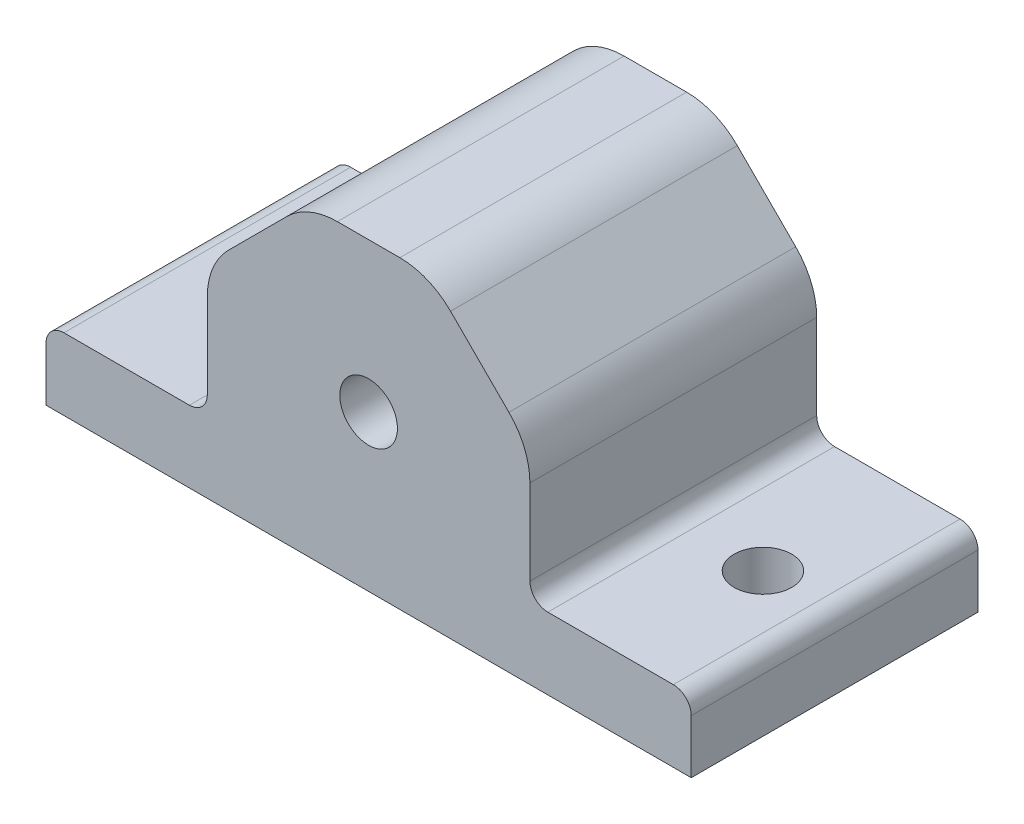
ISO-10303-21;
HEADER;
FILE_DESCRIPTION(('STEP AP214'),'2;1');
FILE_NAME('part.step','',(''),(''),'','','');
FILE_SCHEMA(('AUTOMOTIVE_DESIGN { 1 0 10303 214 1 1 1 1 }'));
ENDSEC;
DATA;
#1=APPLICATION_CONTEXT('core data for automotive mechanical design processes');
#2=APPLICATION_PROTOCOL_DEFINITION('international standard','automotive_design',2000,#1);
#3=PRODUCT_CONTEXT('',#1,'mechanical');
#4=PRODUCT('Part','Part','',(#3));
#5=PRODUCT_RELATED_PRODUCT_CATEGORY('part','',(#4));
#6=PRODUCT_DEFINITION_FORMATION('','',#4);
#7=PRODUCT_DEFINITION_CONTEXT('part definition',#1,'design');
#8=PRODUCT_DEFINITION('design','',#6,#7);
#9=PRODUCT_DEFINITION_SHAPE('','',#8);
#10=(LENGTH_UNIT() NAMED_UNIT(*) SI_UNIT(.MILLI.,.METRE.));
#11=(NAMED_UNIT(*) PLANE_ANGLE_UNIT() SI_UNIT($,.RADIAN.));
#12=(NAMED_UNIT(*) SI_UNIT($,.STERADIAN.) SOLID_ANGLE_UNIT());
#13=UNCERTAINTY_MEASURE_WITH_UNIT(LENGTH_MEASURE(1.E-05),#10,'distance_accuracy_value','');
#14=(GEOMETRIC_REPRESENTATION_CONTEXT(3) GLOBAL_UNCERTAINTY_ASSIGNED_CONTEXT((#13)) GLOBAL_UNIT_ASSIGNED_CONTEXT((#10,
#11,#12)) REPRESENTATION_CONTEXT('',''));
#15=CARTESIAN_POINT('',(0.,0.,0.));
#16=DIRECTION('',(0.,0.,1.));
#17=DIRECTION('',(1.,0.,0.));
#18=AXIS2_PLACEMENT_3D('',#15,#16,#17);
#19=CARTESIAN_POINT('',(-5.39749999999998,26.9875,-25.4));
#20=DIRECTION('',(-0.707106781186549,0.707106781186546,0.));
#21=DIRECTION('',(-0.707106781186546,-0.707106781186549,0.));
#22=AXIS2_PLACEMENT_3D('',#19,#20,#21);
#23=PLANE('',#22);
#24=DIRECTION('',(-0.707106781186546,-0.707106781186549,0.));
#25=VECTOR('',#24,1.);
#26=CARTESIAN_POINT('',(-5.39749999999998,26.9875,0.));
#27=LINE('',#26,#25);
#28=CARTESIAN_POINT('',(-7.25737193946541,25.1276280605346,0.));
#29=VERTEX_POINT('',#28);
#30=CARTESIAN_POINT('',(-12.4276280605346,19.9573719394654,0.));
#31=VERTEX_POINT('',#30);
#32=EDGE_CURVE('E201',#29,#31,#27,.T.);
#33=ORIENTED_EDGE('',*,*,#32,.F.);
#34=DIRECTION('',(0.,0.,1.));
#35=VECTOR('',#34,1.);
#36=CARTESIAN_POINT('',(-7.25737193946541,25.1276280605346,-25.4));
#37=LINE('',#36,#35);
#38=CARTESIAN_POINT('',(-7.25737193946541,25.1276280605346,-25.4));
#39=VERTEX_POINT('',#38);
#40=EDGE_CURVE('E281',#29,#39,#37,.F.);
#41=ORIENTED_EDGE('',*,*,#40,.T.);
#42=DIRECTION('',(-0.707106781186546,-0.707106781186549,0.));
#43=VECTOR('',#42,1.);
#44=CARTESIAN_POINT('',(-5.39749999999998,26.9875,-25.4));
#45=LINE('',#44,#43);
#46=CARTESIAN_POINT('',(-12.4276280605346,19.9573719394654,-25.4));
#47=VERTEX_POINT('',#46);
#48=EDGE_CURVE('E227',#39,#47,#45,.T.);
#49=ORIENTED_EDGE('',*,*,#48,.T.);
#50=DIRECTION('',(0.,0.,1.));
#51=VECTOR('',#50,1.);
#52=CARTESIAN_POINT('',(-12.4276280605346,19.9573719394654,-25.4));
#53=LINE('',#52,#51);
#54=EDGE_CURVE('E278',#47,#31,#53,.T.);
#55=ORIENTED_EDGE('',*,*,#54,.T.);
#56=EDGE_LOOP('',(#33,#41,#49,#55));
#57=FACE_BOUND('',#56,.T.);
#58=ADVANCED_FACE('F35',(#57),#23,.T.);
#59=CARTESIAN_POINT('',(-5.39749999999998,26.9875,-25.4));
#60=DIRECTION('',(0.,1.,0.));
#61=DIRECTION('',(0.,0.,1.));
#62=AXIS2_PLACEMENT_3D('',#59,#60,#61);
#63=PLANE('',#62);
#64=DIRECTION('',(-1.,0.,0.));
#65=VECTOR('',#64,1.);
#66=CARTESIAN_POINT('',(-5.39749999999998,26.9875,-25.4));
#67=LINE('',#66,#65);
#68=CARTESIAN_POINT('',(2.76724387893081,26.9875,-25.4));
#69=VERTEX_POINT('',#68);
#70=CARTESIAN_POINT('',(-2.76724387893083,26.9875,-25.4));
#71=VERTEX_POINT('',#70);
#72=EDGE_CURVE('E181',#69,#71,#67,.T.);
#73=ORIENTED_EDGE('',*,*,#72,.T.);
#74=DIRECTION('',(0.,0.,1.));
#75=VECTOR('',#74,1.);
#76=CARTESIAN_POINT('',(-2.76724387893083,26.9875,-25.4));
#77=LINE('',#76,#75);
#78=CARTESIAN_POINT('',(-2.76724387893083,26.9875,0.));
#79=VERTEX_POINT('',#78);
#80=EDGE_CURVE('E267',#71,#79,#77,.T.);
#81=ORIENTED_EDGE('',*,*,#80,.T.);
#82=DIRECTION('',(-1.,0.,0.));
#83=VECTOR('',#82,1.);
#84=CARTESIAN_POINT('',(-5.39749999999998,26.9875,0.));
#85=LINE('',#84,#83);
#86=CARTESIAN_POINT('',(2.76724387893081,26.9875,0.));
#87=VERTEX_POINT('',#86);
#88=EDGE_CURVE('E224',#87,#79,#85,.T.);
#89=ORIENTED_EDGE('',*,*,#88,.F.);
#90=DIRECTION('',(0.,0.,1.));
#91=VECTOR('',#90,1.);
#92=CARTESIAN_POINT('',(2.76724387893081,26.9875,-25.4));
#93=LINE('',#92,#91);
#94=EDGE_CURVE('E265',#87,#69,#93,.F.);
#95=ORIENTED_EDGE('',*,*,#94,.T.);
#96=EDGE_LOOP('',(#73,#81,#89,#95));
#97=FACE_BOUND('',#96,.T.);
#98=ADVANCED_FACE('F372',(#97),#63,.T.);
#99=CARTESIAN_POINT('',(14.2875,18.0975,-25.4));
#100=DIRECTION('',(0.707106781186546,0.707106781186549,0.));
#101=DIRECTION('',(-0.707106781186549,0.707106781186546,0.));
#102=AXIS2_PLACEMENT_3D('',#99,#100,#101);
#103=PLANE('',#102);
#104=DIRECTION('',(-0.707106781186549,0.707106781186546,0.));
#105=VECTOR('',#104,1.);
#106=CARTESIAN_POINT('',(14.2875,18.0975,-25.4));
#107=LINE('',#106,#105);
#108=CARTESIAN_POINT('',(12.4276280605346,19.9573719394654,-25.4));
#109=VERTEX_POINT('',#108);
#110=CARTESIAN_POINT('',(7.25737193946538,25.1276280605346,-25.4));
#111=VERTEX_POINT('',#110);
#112=EDGE_CURVE('E197',#109,#111,#107,.T.);
#113=ORIENTED_EDGE('',*,*,#112,.T.);
#114=DIRECTION('',(0.,0.,1.));
#115=VECTOR('',#114,1.);
#116=CARTESIAN_POINT('',(7.25737193946538,25.1276280605346,-25.4));
#117=LINE('',#116,#115);
#118=CARTESIAN_POINT('',(7.25737193946538,25.1276280605346,0.));
#119=VERTEX_POINT('',#118);
#120=EDGE_CURVE('E291',#111,#119,#117,.T.);
#121=ORIENTED_EDGE('',*,*,#120,.T.);
#122=DIRECTION('',(-0.707106781186549,0.707106781186546,0.));
#123=VECTOR('',#122,1.);
#124=CARTESIAN_POINT('',(14.2875,18.0975,0.));
#125=LINE('',#124,#123);
#126=CARTESIAN_POINT('',(12.4276280605346,19.9573719394654,0.));
#127=VERTEX_POINT('',#126);
#128=EDGE_CURVE('E221',#127,#119,#125,.T.);
#129=ORIENTED_EDGE('',*,*,#128,.F.);
#130=DIRECTION('',(0.,0.,1.));
#131=VECTOR('',#130,1.);
#132=CARTESIAN_POINT('',(12.4276280605346,19.9573719394654,-25.4));
#133=LINE('',#132,#131);
#134=EDGE_CURVE('E289',#127,#109,#133,.F.);
#135=ORIENTED_EDGE('',*,*,#134,.T.);
#136=EDGE_LOOP('',(#113,#121,#129,#135));
#137=FACE_BOUND('',#136,.T.);
#138=ADVANCED_FACE('F378',(#137),#103,.T.);
#139=CARTESIAN_POINT('',(14.2875,6.35,-25.4));
#140=DIRECTION('',(1.,0.,0.));
#141=DIRECTION('',(0.,1.,0.));
#142=AXIS2_PLACEMENT_3D('',#139,#140,#141);
#143=PLANE('',#142);
#144=DIRECTION('',(0.,1.,0.));
#145=VECTOR('',#144,1.);
#146=CARTESIAN_POINT('',(14.2875,6.35,-25.4));
#147=LINE('',#146,#145);
#148=CARTESIAN_POINT('',(14.2875,7.9375,-25.4));
#149=VERTEX_POINT('',#148);
#150=CARTESIAN_POINT('',(14.2875,15.4672438789308,-25.4));
#151=VERTEX_POINT('',#150);
#152=EDGE_CURVE('E195',#149,#151,#147,.T.);
#153=ORIENTED_EDGE('',*,*,#152,.T.);
#154=DIRECTION('',(0.,0.,1.));
#155=VECTOR('',#154,1.);
#156=CARTESIAN_POINT('',(14.2875,15.4672438789308,-25.4));
#157=LINE('',#156,#155);
#158=CARTESIAN_POINT('',(14.2875,15.4672438789308,0.));
#159=VERTEX_POINT('',#158);
#160=EDGE_CURVE('E44',#151,#159,#157,.T.);
#161=ORIENTED_EDGE('',*,*,#160,.T.);
#162=DIRECTION('',(0.,1.,0.));
#163=VECTOR('',#162,1.);
#164=CARTESIAN_POINT('',(14.2875,6.35,0.));
#165=LINE('',#164,#163);
#166=CARTESIAN_POINT('',(14.2875,7.9375,0.));
#167=VERTEX_POINT('',#166);
#168=EDGE_CURVE('E218',#167,#159,#165,.T.);
#169=ORIENTED_EDGE('',*,*,#168,.F.);
#170=DIRECTION('',(0.,0.,1.));
#171=VECTOR('',#170,1.);
#172=CARTESIAN_POINT('',(14.2875,7.9375,-25.4));
#173=LINE('',#172,#171);
#174=EDGE_CURVE('E251',#167,#149,#173,.F.);
#175=ORIENTED_EDGE('',*,*,#174,.T.);
#176=EDGE_LOOP('',(#153,#161,#169,#175));
#177=FACE_BOUND('',#176,.T.);
#178=ADVANCED_FACE('F298',(#177),#143,.T.);
#179=CARTESIAN_POINT('',(28.575,6.35,-25.4));
#180=DIRECTION('',(0.,1.,0.));
#181=DIRECTION('',(-1.,0.,0.));
#182=AXIS2_PLACEMENT_3D('',#179,#180,#181);
#183=PLANE('',#182);
#184=CARTESIAN_POINT('',(22.225,6.35,-12.7));
#185=DIRECTION('',(0.,1.,0.));
#186=DIRECTION('',(-1.,0.,0.));
#187=AXIS2_PLACEMENT_3D('',#184,#185,#186);
#188=CIRCLE('',#187,2.5527);
#189=CARTESIAN_POINT('',(19.6723,6.35,-12.7));
#190=VERTEX_POINT('',#189);
#191=EDGE_CURVE('E338',#190,#190,#188,.F.);
#192=ORIENTED_EDGE('',*,*,#191,.T.);
#193=EDGE_LOOP('',(#192));
#194=FACE_BOUND('',#193,.T.);
#195=DIRECTION('',(-1.,0.,0.));
#196=VECTOR('',#195,1.);
#197=CARTESIAN_POINT('',(28.575,6.35,-25.4));
#198=LINE('',#197,#196);
#199=CARTESIAN_POINT('',(26.9875,6.35,-25.4));
#200=VERTEX_POINT('',#199);
#201=CARTESIAN_POINT('',(15.875,6.35,-25.4));
#202=VERTEX_POINT('',#201);
#203=EDGE_CURVE('E189',#200,#202,#198,.T.);
#204=ORIENTED_EDGE('',*,*,#203,.T.);
#205=DIRECTION('',(0.,0.,1.));
#206=VECTOR('',#205,1.);
#207=CARTESIAN_POINT('',(15.875,6.35,0.));
#208=LINE('',#207,#206);
#209=CARTESIAN_POINT('',(15.875,6.35,0.));
#210=VERTEX_POINT('',#209);
#211=EDGE_CURVE('E248',#202,#210,#208,.T.);
#212=ORIENTED_EDGE('',*,*,#211,.T.);
#213=DIRECTION('',(-1.,0.,0.));
#214=VECTOR('',#213,1.);
#215=CARTESIAN_POINT('',(28.575,6.35,0.));
#216=LINE('',#215,#214);
#217=CARTESIAN_POINT('',(26.9875,6.35,0.));
#218=VERTEX_POINT('',#217);
#219=EDGE_CURVE('E215',#218,#210,#216,.T.);
#220=ORIENTED_EDGE('',*,*,#219,.F.);
#221=DIRECTION('',(0.,0.,1.));
#222=VECTOR('',#221,1.);
#223=CARTESIAN_POINT('',(26.9875,6.35,-25.4));
#224=LINE('',#223,#222);
#225=EDGE_CURVE('E246',#218,#200,#224,.F.);
#226=ORIENTED_EDGE('',*,*,#225,.T.);
#227=EDGE_LOOP('',(#204,#212,#220,#226));
#228=FACE_BOUND('',#227,.T.);
#229=ADVANCED_FACE('F310',(#194,#228),#183,.T.);
#230=CARTESIAN_POINT('',(28.575,0.,-25.4));
#231=DIRECTION('',(1.,0.,0.));
#232=DIRECTION('',(0.,1.,0.));
#233=AXIS2_PLACEMENT_3D('',#230,#231,#232);
#234=PLANE('',#233);
#235=DIRECTION('',(0.,1.,0.));
#236=VECTOR('',#235,1.);
#237=CARTESIAN_POINT('',(28.575,0.,-25.4));
#238=LINE('',#237,#236);
#239=CARTESIAN_POINT('',(28.575,0.,-25.4));
#240=VERTEX_POINT('',#239);
#241=CARTESIAN_POINT('',(28.575,4.7625,-25.4));
#242=VERTEX_POINT('',#241);
#243=EDGE_CURVE('E187',#240,#242,#238,.T.);
#244=ORIENTED_EDGE('',*,*,#243,.T.);
#245=DIRECTION('',(0.,0.,1.));
#246=VECTOR('',#245,1.);
#247=CARTESIAN_POINT('',(28.575,4.7625,-25.4));
#248=LINE('',#247,#246);
#249=CARTESIAN_POINT('',(28.575,4.7625,0.));
#250=VERTEX_POINT('',#249);
#251=EDGE_CURVE('E253',#242,#250,#248,.T.);
#252=ORIENTED_EDGE('',*,*,#251,.T.);
#253=DIRECTION('',(0.,1.,0.));
#254=VECTOR('',#253,1.);
#255=CARTESIAN_POINT('',(28.575,0.,0.));
#256=LINE('',#255,#254);
#257=CARTESIAN_POINT('',(28.575,0.,0.));
#258=VERTEX_POINT('',#257);
#259=EDGE_CURVE('E212',#258,#250,#256,.T.);
#260=ORIENTED_EDGE('',*,*,#259,.F.);
#261=DIRECTION('',(0.,0.,1.));
#262=VECTOR('',#261,1.);
#263=CARTESIAN_POINT('',(28.575,0.,-25.4));
#264=LINE('',#263,#262);
#265=EDGE_CURVE('E180',#240,#258,#264,.T.);
#266=ORIENTED_EDGE('',*,*,#265,.F.);
#267=EDGE_LOOP('',(#244,#252,#260,#266));
#268=FACE_BOUND('',#267,.T.);
#269=ADVANCED_FACE('F319',(#268),#234,.T.);
#270=CARTESIAN_POINT('',(-28.575,0.,-25.4));
#271=DIRECTION('',(0.,-1.,0.));
#272=DIRECTION('',(0.,0.,-1.));
#273=AXIS2_PLACEMENT_3D('',#270,#271,#272);
#274=PLANE('',#273);
#275=CARTESIAN_POINT('',(22.225,0.,-12.7));
#276=DIRECTION('',(0.,1.,0.));
#277=DIRECTION('',(0.,0.,1.));
#278=AXIS2_PLACEMENT_3D('',#275,#276,#277);
#279=CIRCLE('',#278,2.5527);
#280=CARTESIAN_POINT('',(22.225,0.,-10.1473));
#281=VERTEX_POINT('',#280);
#282=EDGE_CURVE('E341',#281,#281,#279,.T.);
#283=ORIENTED_EDGE('',*,*,#282,.T.);
#284=EDGE_LOOP('',(#283));
#285=FACE_BOUND('',#284,.T.);
#286=CARTESIAN_POINT('',(-22.225,0.,-12.7));
#287=DIRECTION('',(0.,-1.,0.));
#288=DIRECTION('',(0.,0.,1.));
#289=AXIS2_PLACEMENT_3D('',#286,#287,#288);
#290=CIRCLE('',#289,2.5527);
#291=CARTESIAN_POINT('',(-22.225,0.,-10.1473));
#292=VERTEX_POINT('',#291);
#293=EDGE_CURVE('E335',#292,#292,#290,.T.);
#294=ORIENTED_EDGE('',*,*,#293,.F.);
#295=EDGE_LOOP('',(#294));
#296=FACE_BOUND('',#295,.T.);
#297=DIRECTION('',(1.,0.,0.));
#298=VECTOR('',#297,1.);
#299=CARTESIAN_POINT('',(-28.575,0.,0.));
#300=LINE('',#299,#298);
#301=CARTESIAN_POINT('',(-28.575,0.,0.));
#302=VERTEX_POINT('',#301);
#303=EDGE_CURVE('E179',#302,#258,#300,.T.);
#304=ORIENTED_EDGE('',*,*,#303,.F.);
#305=DIRECTION('',(0.,0.,1.));
#306=VECTOR('',#305,1.);
#307=CARTESIAN_POINT('',(-28.575,0.,-25.4));
#308=LINE('',#307,#306);
#309=CARTESIAN_POINT('',(-28.575,0.,-25.4));
#310=VERTEX_POINT('',#309);
#311=EDGE_CURVE('E166',#310,#302,#308,.T.);
#312=ORIENTED_EDGE('',*,*,#311,.F.);
#313=DIRECTION('',(1.,0.,0.));
#314=VECTOR('',#313,1.);
#315=CARTESIAN_POINT('',(-28.575,0.,-25.4));
#316=LINE('',#315,#314);
#317=EDGE_CURVE('E172',#310,#240,#316,.T.);
#318=ORIENTED_EDGE('',*,*,#317,.T.);
#319=ORIENTED_EDGE('',*,*,#265,.T.);
#320=EDGE_LOOP('',(#304,#312,#318,#319));
#321=FACE_BOUND('',#320,.T.);
#322=ADVANCED_FACE('F177',(#285,#296,#321),#274,.T.);
#323=CARTESIAN_POINT('',(-28.575,6.35,-25.4));
#324=DIRECTION('',(-1.,0.,0.));
#325=DIRECTION('',(0.,-1.,0.));
#326=AXIS2_PLACEMENT_3D('',#323,#324,#325);
#327=PLANE('',#326);
#328=DIRECTION('',(0.,-1.,0.));
#329=VECTOR('',#328,1.);
#330=CARTESIAN_POINT('',(-28.575,6.35,0.));
#331=LINE('',#330,#329);
#332=CARTESIAN_POINT('',(-28.575,4.7625,0.));
#333=VERTEX_POINT('',#332);
#334=EDGE_CURVE('E209',#333,#302,#331,.T.);
#335=ORIENTED_EDGE('',*,*,#334,.F.);
#336=DIRECTION('',(0.,0.,1.));
#337=VECTOR('',#336,1.);
#338=CARTESIAN_POINT('',(-28.575,4.7625,-25.4));
#339=LINE('',#338,#337);
#340=CARTESIAN_POINT('',(-28.575,4.7625,-25.4));
#341=VERTEX_POINT('',#340);
#342=EDGE_CURVE('E169',#333,#341,#339,.F.);
#343=ORIENTED_EDGE('',*,*,#342,.T.);
#344=DIRECTION('',(0.,-1.,0.));
#345=VECTOR('',#344,1.);
#346=CARTESIAN_POINT('',(-28.575,6.35,-25.4));
#347=LINE('',#346,#345);
#348=EDGE_CURVE('E162',#341,#310,#347,.T.);
#349=ORIENTED_EDGE('',*,*,#348,.T.);
#350=ORIENTED_EDGE('',*,*,#311,.T.);
#351=EDGE_LOOP('',(#335,#343,#349,#350));
#352=FACE_BOUND('',#351,.T.);
#353=ADVANCED_FACE('F165',(#352),#327,.T.);
#354=CARTESIAN_POINT('',(-14.2875,6.35,-25.4));
#355=DIRECTION('',(0.,1.,0.));
#356=DIRECTION('',(-1.,0.,0.));
#357=AXIS2_PLACEMENT_3D('',#354,#355,#356);
#358=PLANE('',#357);
#359=CARTESIAN_POINT('',(-22.225,6.35,-12.7));
#360=DIRECTION('',(0.,1.,0.));
#361=DIRECTION('',(-1.,0.,0.));
#362=AXIS2_PLACEMENT_3D('',#359,#360,#361);
#363=CIRCLE('',#362,2.5527);
#364=CARTESIAN_POINT('',(-24.7777,6.35,-12.7));
#365=VERTEX_POINT('',#364);
#366=EDGE_CURVE('E39',#365,#365,#363,.T.);
#367=ORIENTED_EDGE('',*,*,#366,.F.);
#368=EDGE_LOOP('',(#367));
#369=FACE_BOUND('',#368,.T.);
#370=DIRECTION('',(-1.,0.,0.));
#371=VECTOR('',#370,1.);
#372=CARTESIAN_POINT('',(-14.2875,6.35,0.));
#373=LINE('',#372,#371);
#374=CARTESIAN_POINT('',(-15.875,6.35,0.));
#375=VERTEX_POINT('',#374);
#376=CARTESIAN_POINT('',(-26.9875,6.35,0.));
#377=VERTEX_POINT('',#376);
#378=EDGE_CURVE('E206',#375,#377,#373,.T.);
#379=ORIENTED_EDGE('',*,*,#378,.F.);
#380=DIRECTION('',(0.,0.,1.));
#381=VECTOR('',#380,1.);
#382=CARTESIAN_POINT('',(-15.875,6.35,-25.4));
#383=LINE('',#382,#381);
#384=CARTESIAN_POINT('',(-15.875,6.35,-25.4));
#385=VERTEX_POINT('',#384);
#386=EDGE_CURVE('E235',#375,#385,#383,.F.);
#387=ORIENTED_EDGE('',*,*,#386,.T.);
#388=DIRECTION('',(-1.,0.,0.));
#389=VECTOR('',#388,1.);
#390=CARTESIAN_POINT('',(-14.2875,6.35,-25.4));
#391=LINE('',#390,#389);
#392=CARTESIAN_POINT('',(-26.9875,6.35,-25.4));
#393=VERTEX_POINT('',#392);
#394=EDGE_CURVE('E173',#385,#393,#391,.T.);
#395=ORIENTED_EDGE('',*,*,#394,.T.);
#396=DIRECTION('',(0.,0.,1.));
#397=VECTOR('',#396,1.);
#398=CARTESIAN_POINT('',(-26.9875,6.35,-25.4));
#399=LINE('',#398,#397);
#400=EDGE_CURVE('E232',#393,#377,#399,.T.);
#401=ORIENTED_EDGE('',*,*,#400,.T.);
#402=EDGE_LOOP('',(#379,#387,#395,#401));
#403=FACE_BOUND('',#402,.T.);
#404=ADVANCED_FACE('F328',(#369,#403),#358,.T.);
#405=CARTESIAN_POINT('',(-14.2875,18.0975,-25.4));
#406=DIRECTION('',(-1.,0.,0.));
#407=DIRECTION('',(0.,0.,1.));
#408=AXIS2_PLACEMENT_3D('',#405,#406,#407);
#409=PLANE('',#408);
#410=DIRECTION('',(0.,-1.,0.));
#411=VECTOR('',#410,1.);
#412=CARTESIAN_POINT('',(-14.2875,18.0975,0.));
#413=LINE('',#412,#411);
#414=CARTESIAN_POINT('',(-14.2875,15.4672438789308,0.));
#415=VERTEX_POINT('',#414);
#416=CARTESIAN_POINT('',(-14.2875,7.9375,0.));
#417=VERTEX_POINT('',#416);
#418=EDGE_CURVE('E204',#415,#417,#413,.T.);
#419=ORIENTED_EDGE('',*,*,#418,.F.);
#420=DIRECTION('',(0.,0.,1.));
#421=VECTOR('',#420,1.);
#422=CARTESIAN_POINT('',(-14.2875,15.4672438789308,-25.4));
#423=LINE('',#422,#421);
#424=CARTESIAN_POINT('',(-14.2875,15.4672438789308,-25.4));
#425=VERTEX_POINT('',#424);
#426=EDGE_CURVE('E11',#415,#425,#423,.F.);
#427=ORIENTED_EDGE('',*,*,#426,.T.);
#428=DIRECTION('',(0.,-1.,0.));
#429=VECTOR('',#428,1.);
#430=CARTESIAN_POINT('',(-14.2875,18.0975,-25.4));
#431=LINE('',#430,#429);
#432=CARTESIAN_POINT('',(-14.2875,7.9375,-25.4));
#433=VERTEX_POINT('',#432);
#434=EDGE_CURVE('E330',#425,#433,#431,.T.);
#435=ORIENTED_EDGE('',*,*,#434,.T.);
#436=DIRECTION('',(0.,0.,1.));
#437=VECTOR('',#436,1.);
#438=CARTESIAN_POINT('',(-14.2875,7.9375,0.));
#439=LINE('',#438,#437);
#440=EDGE_CURVE('E228',#433,#417,#439,.T.);
#441=ORIENTED_EDGE('',*,*,#440,.T.);
#442=EDGE_LOOP('',(#419,#427,#435,#441));
#443=FACE_BOUND('',#442,.T.);
#444=ADVANCED_FACE('F360',(#443),#409,.T.);
#445=CARTESIAN_POINT('',(0.,0.,-25.4));
#446=DIRECTION('',(0.,0.,-1.));
#447=DIRECTION('',(-1.,0.,0.));
#448=AXIS2_PLACEMENT_3D('',#445,#446,#447);
#449=PLANE('',#448);
#450=CARTESIAN_POINT('',(0.,13.7668,-25.4));
#451=DIRECTION('',(0.,0.,-1.));
#452=DIRECTION('',(1.,0.,0.));
#453=AXIS2_PLACEMENT_3D('',#450,#451,#452);
#454=CIRCLE('',#453,2.5527);
#455=CARTESIAN_POINT('',(2.55269999999999,13.7668,-25.4));
#456=VERTEX_POINT('',#455);
#457=EDGE_CURVE('E345',#456,#456,#454,.T.);
#458=ORIENTED_EDGE('',*,*,#457,.F.);
#459=EDGE_LOOP('',(#458));
#460=FACE_BOUND('',#459,.T.);
#461=ORIENTED_EDGE('',*,*,#48,.F.);
#462=CARTESIAN_POINT('',(-2.76724387893083,20.6375,-25.4));
#463=DIRECTION('',(0.,0.,-1.));
#464=DIRECTION('',(-1.,0.,0.));
#465=AXIS2_PLACEMENT_3D('',#462,#463,#464);
#466=CIRCLE('',#465,6.35);
#467=EDGE_CURVE('E287',#39,#71,#466,.T.);
#468=ORIENTED_EDGE('',*,*,#467,.T.);
#469=ORIENTED_EDGE('',*,*,#72,.F.);
#470=CARTESIAN_POINT('',(2.76724387893081,20.6375,-25.4));
#471=DIRECTION('',(0.,0.,-1.));
#472=DIRECTION('',(-1.,0.,0.));
#473=AXIS2_PLACEMENT_3D('',#470,#471,#472);
#474=CIRCLE('',#473,6.35);
#475=EDGE_CURVE('E57',#69,#111,#474,.T.);
#476=ORIENTED_EDGE('',*,*,#475,.T.);
#477=ORIENTED_EDGE('',*,*,#112,.F.);
#478=CARTESIAN_POINT('',(7.9375,15.4672438789308,-25.4));
#479=DIRECTION('',(0.,0.,-1.));
#480=DIRECTION('',(-1.,0.,0.));
#481=AXIS2_PLACEMENT_3D('',#478,#479,#480);
#482=CIRCLE('',#481,6.35);
#483=EDGE_CURVE('E51',#109,#151,#482,.T.);
#484=ORIENTED_EDGE('',*,*,#483,.T.);
#485=ORIENTED_EDGE('',*,*,#152,.F.);
#486=CARTESIAN_POINT('',(15.875,7.9375,-25.4));
#487=DIRECTION('',(0.,0.,-1.));
#488=DIRECTION('',(-1.,0.,0.));
#489=AXIS2_PLACEMENT_3D('',#486,#487,#488);
#490=CIRCLE('',#489,1.5875);
#491=EDGE_CURVE('E263',#149,#202,#490,.F.);
#492=ORIENTED_EDGE('',*,*,#491,.T.);
#493=ORIENTED_EDGE('',*,*,#203,.F.);
#494=CARTESIAN_POINT('',(26.9875,4.7625,-25.4));
#495=DIRECTION('',(0.,0.,-1.));
#496=DIRECTION('',(-1.,0.,0.));
#497=AXIS2_PLACEMENT_3D('',#494,#495,#496);
#498=CIRCLE('',#497,1.5875);
#499=EDGE_CURVE('E242',#200,#242,#498,.T.);
#500=ORIENTED_EDGE('',*,*,#499,.T.);
#501=ORIENTED_EDGE('',*,*,#243,.F.);
#502=ORIENTED_EDGE('',*,*,#317,.F.);
#503=ORIENTED_EDGE('',*,*,#348,.F.);
#504=CARTESIAN_POINT('',(-26.9875,4.7625,-25.4));
#505=DIRECTION('',(0.,0.,-1.));
#506=DIRECTION('',(-1.,0.,0.));
#507=AXIS2_PLACEMENT_3D('',#504,#505,#506);
#508=CIRCLE('',#507,1.5875);
#509=EDGE_CURVE('E244',#341,#393,#508,.T.);
#510=ORIENTED_EDGE('',*,*,#509,.T.);
#511=ORIENTED_EDGE('',*,*,#394,.F.);
#512=CARTESIAN_POINT('',(-15.875,7.9375,-25.4));
#513=DIRECTION('',(0.,0.,-1.));
#514=DIRECTION('',(-1.,0.,0.));
#515=AXIS2_PLACEMENT_3D('',#512,#513,#514);
#516=CIRCLE('',#515,1.5875);
#517=EDGE_CURVE('E258',#385,#433,#516,.F.);
#518=ORIENTED_EDGE('',*,*,#517,.T.);
#519=ORIENTED_EDGE('',*,*,#434,.F.);
#520=CARTESIAN_POINT('',(-7.9375,15.4672438789308,-25.4));
#521=DIRECTION('',(0.,0.,-1.));
#522=DIRECTION('',(-1.,0.,0.));
#523=AXIS2_PLACEMENT_3D('',#520,#521,#522);
#524=CIRCLE('',#523,6.35);
#525=EDGE_CURVE('E283',#425,#47,#524,.T.);
#526=ORIENTED_EDGE('',*,*,#525,.T.);
#527=EDGE_LOOP('',(#461,#468,#469,#476,#477,#484,#485,#492,#493,#500,#501,#502,#503,#510,#511,
#518,#519,#526));
#528=FACE_BOUND('',#527,.T.);
#529=ADVANCED_FACE('F185',(#460,#528),#449,.T.);
#530=CARTESIAN_POINT('',(0.,0.,0.));
#531=DIRECTION('',(0.,0.,-1.));
#532=DIRECTION('',(-1.,0.,0.));
#533=AXIS2_PLACEMENT_3D('',#530,#531,#532);
#534=PLANE('',#533);
#535=CARTESIAN_POINT('',(0.,13.7668,0.));
#536=DIRECTION('',(0.,0.,-1.));
#537=DIRECTION('',(1.,0.,0.));
#538=AXIS2_PLACEMENT_3D('',#535,#536,#537);
#539=CIRCLE('',#538,2.5527);
#540=CARTESIAN_POINT('',(2.55269999999999,13.7668,0.));
#541=VERTEX_POINT('',#540);
#542=EDGE_CURVE('E344',#541,#541,#539,.T.);
#543=ORIENTED_EDGE('',*,*,#542,.T.);
#544=EDGE_LOOP('',(#543));
#545=FACE_BOUND('',#544,.T.);
#546=ORIENTED_EDGE('',*,*,#88,.T.);
#547=CARTESIAN_POINT('',(-2.76724387893083,20.6375,0.));
#548=DIRECTION('',(0.,0.,-1.));
#549=DIRECTION('',(-1.,0.,0.));
#550=AXIS2_PLACEMENT_3D('',#547,#548,#549);
#551=CIRCLE('',#550,6.35);
#552=EDGE_CURVE('E276',#79,#29,#551,.F.);
#553=ORIENTED_EDGE('',*,*,#552,.T.);
#554=ORIENTED_EDGE('',*,*,#32,.T.);
#555=CARTESIAN_POINT('',(-7.9375,15.4672438789308,0.));
#556=DIRECTION('',(0.,0.,-1.));
#557=DIRECTION('',(-1.,0.,0.));
#558=AXIS2_PLACEMENT_3D('',#555,#556,#557);
#559=CIRCLE('',#558,6.35);
#560=EDGE_CURVE('E270',#31,#415,#559,.F.);
#561=ORIENTED_EDGE('',*,*,#560,.T.);
#562=ORIENTED_EDGE('',*,*,#418,.T.);
#563=CARTESIAN_POINT('',(-15.875,7.9375,0.));
#564=DIRECTION('',(0.,0.,-1.));
#565=DIRECTION('',(-1.,0.,0.));
#566=AXIS2_PLACEMENT_3D('',#563,#564,#565);
#567=CIRCLE('',#566,1.5875);
#568=EDGE_CURVE('E256',#417,#375,#567,.T.);
#569=ORIENTED_EDGE('',*,*,#568,.T.);
#570=ORIENTED_EDGE('',*,*,#378,.T.);
#571=CARTESIAN_POINT('',(-26.9875,4.7625,0.));
#572=DIRECTION('',(0.,0.,-1.));
#573=DIRECTION('',(-1.,0.,0.));
#574=AXIS2_PLACEMENT_3D('',#571,#572,#573);
#575=CIRCLE('',#574,1.5875);
#576=EDGE_CURVE('E239',#377,#333,#575,.F.);
#577=ORIENTED_EDGE('',*,*,#576,.T.);
#578=ORIENTED_EDGE('',*,*,#334,.T.);
#579=ORIENTED_EDGE('',*,*,#303,.T.);
#580=ORIENTED_EDGE('',*,*,#259,.T.);
#581=CARTESIAN_POINT('',(26.9875,4.7625,0.));
#582=DIRECTION('',(0.,0.,-1.));
#583=DIRECTION('',(-1.,0.,0.));
#584=AXIS2_PLACEMENT_3D('',#581,#582,#583);
#585=CIRCLE('',#584,1.5875);
#586=EDGE_CURVE('E237',#250,#218,#585,.F.);
#587=ORIENTED_EDGE('',*,*,#586,.T.);
#588=ORIENTED_EDGE('',*,*,#219,.T.);
#589=CARTESIAN_POINT('',(15.875,7.9375,0.));
#590=DIRECTION('',(0.,0.,-1.));
#591=DIRECTION('',(-1.,0.,0.));
#592=AXIS2_PLACEMENT_3D('',#589,#590,#591);
#593=CIRCLE('',#592,1.5875);
#594=EDGE_CURVE('E261',#210,#167,#593,.T.);
#595=ORIENTED_EDGE('',*,*,#594,.T.);
#596=ORIENTED_EDGE('',*,*,#168,.T.);
#597=CARTESIAN_POINT('',(7.9375,15.4672438789308,0.));
#598=DIRECTION('',(0.,0.,-1.));
#599=DIRECTION('',(-1.,0.,0.));
#600=AXIS2_PLACEMENT_3D('',#597,#598,#599);
#601=CIRCLE('',#600,6.35);
#602=EDGE_CURVE('E272',#159,#127,#601,.F.);
#603=ORIENTED_EDGE('',*,*,#602,.T.);
#604=ORIENTED_EDGE('',*,*,#128,.T.);
#605=CARTESIAN_POINT('',(2.76724387893081,20.6375,0.));
#606=DIRECTION('',(0.,0.,-1.));
#607=DIRECTION('',(-1.,0.,0.));
#608=AXIS2_PLACEMENT_3D('',#605,#606,#607);
#609=CIRCLE('',#608,6.35);
#610=EDGE_CURVE('E274',#119,#87,#609,.F.);
#611=ORIENTED_EDGE('',*,*,#610,.T.);
#612=EDGE_LOOP('',(#546,#553,#554,#561,#562,#569,#570,#577,#578,#579,#580,#587,#588,#595,#596,
#603,#604,#611));
#613=FACE_BOUND('',#612,.T.);
#614=ADVANCED_FACE('F302',(#545,#613),#534,.F.);
#615=CARTESIAN_POINT('',(-15.875,7.9375,-25.4));
#616=DIRECTION('',(0.,0.,-1.));
#617=DIRECTION('',(-1.,0.,0.));
#618=AXIS2_PLACEMENT_3D('',#615,#616,#617);
#619=CYLINDRICAL_SURFACE('',#618,1.5875);
#620=ORIENTED_EDGE('',*,*,#517,.F.);
#621=ORIENTED_EDGE('',*,*,#386,.F.);
#622=ORIENTED_EDGE('',*,*,#568,.F.);
#623=ORIENTED_EDGE('',*,*,#440,.F.);
#624=EDGE_LOOP('',(#620,#621,#622,#623));
#625=FACE_BOUND('',#624,.T.);
#626=ADVANCED_FACE('F366',(#625),#619,.F.);
#627=CARTESIAN_POINT('',(-26.9875,4.7625,-25.4));
#628=DIRECTION('',(0.,0.,1.));
#629=DIRECTION('',(1.,0.,0.));
#630=AXIS2_PLACEMENT_3D('',#627,#628,#629);
#631=CYLINDRICAL_SURFACE('',#630,1.5875);
#632=ORIENTED_EDGE('',*,*,#509,.F.);
#633=ORIENTED_EDGE('',*,*,#342,.F.);
#634=ORIENTED_EDGE('',*,*,#576,.F.);
#635=ORIENTED_EDGE('',*,*,#400,.F.);
#636=EDGE_LOOP('',(#632,#633,#634,#635));
#637=FACE_BOUND('',#636,.T.);
#638=ADVANCED_FACE('F321',(#637),#631,.T.);
#639=CARTESIAN_POINT('',(15.875,7.9375,-25.4));
#640=DIRECTION('',(0.,0.,-1.));
#641=DIRECTION('',(-1.,0.,0.));
#642=AXIS2_PLACEMENT_3D('',#639,#640,#641);
#643=CYLINDRICAL_SURFACE('',#642,1.5875);
#644=ORIENTED_EDGE('',*,*,#491,.F.);
#645=ORIENTED_EDGE('',*,*,#174,.F.);
#646=ORIENTED_EDGE('',*,*,#594,.F.);
#647=ORIENTED_EDGE('',*,*,#211,.F.);
#648=EDGE_LOOP('',(#644,#645,#646,#647));
#649=FACE_BOUND('',#648,.T.);
#650=ADVANCED_FACE('F308',(#649),#643,.F.);
#651=CARTESIAN_POINT('',(26.9875,4.7625,-25.4));
#652=DIRECTION('',(0.,0.,1.));
#653=DIRECTION('',(1.,0.,0.));
#654=AXIS2_PLACEMENT_3D('',#651,#652,#653);
#655=CYLINDRICAL_SURFACE('',#654,1.5875);
#656=ORIENTED_EDGE('',*,*,#499,.F.);
#657=ORIENTED_EDGE('',*,*,#225,.F.);
#658=ORIENTED_EDGE('',*,*,#586,.F.);
#659=ORIENTED_EDGE('',*,*,#251,.F.);
#660=EDGE_LOOP('',(#656,#657,#658,#659));
#661=FACE_BOUND('',#660,.T.);
#662=ADVANCED_FACE('F316',(#661),#655,.T.);
#663=CARTESIAN_POINT('',(-2.76724387893083,20.6375,-25.4));
#664=DIRECTION('',(0.,0.,1.));
#665=DIRECTION('',(1.,0.,0.));
#666=AXIS2_PLACEMENT_3D('',#663,#664,#665);
#667=CYLINDRICAL_SURFACE('',#666,6.35);
#668=ORIENTED_EDGE('',*,*,#467,.F.);
#669=ORIENTED_EDGE('',*,*,#40,.F.);
#670=ORIENTED_EDGE('',*,*,#552,.F.);
#671=ORIENTED_EDGE('',*,*,#80,.F.);
#672=EDGE_LOOP('',(#668,#669,#670,#671));
#673=FACE_BOUND('',#672,.T.);
#674=ADVANCED_FACE('F393',(#673),#667,.T.);
#675=CARTESIAN_POINT('',(2.76724387893081,20.6375,-25.4));
#676=DIRECTION('',(0.,0.,1.));
#677=DIRECTION('',(1.,0.,0.));
#678=AXIS2_PLACEMENT_3D('',#675,#676,#677);
#679=CYLINDRICAL_SURFACE('',#678,6.35);
#680=ORIENTED_EDGE('',*,*,#475,.F.);
#681=ORIENTED_EDGE('',*,*,#94,.F.);
#682=ORIENTED_EDGE('',*,*,#610,.F.);
#683=ORIENTED_EDGE('',*,*,#120,.F.);
#684=EDGE_LOOP('',(#680,#681,#682,#683));
#685=FACE_BOUND('',#684,.T.);
#686=ADVANCED_FACE('F396',(#685),#679,.T.);
#687=CARTESIAN_POINT('',(7.9375,15.4672438789308,-25.4));
#688=DIRECTION('',(0.,0.,1.));
#689=DIRECTION('',(1.,0.,0.));
#690=AXIS2_PLACEMENT_3D('',#687,#688,#689);
#691=CYLINDRICAL_SURFACE('',#690,6.35);
#692=ORIENTED_EDGE('',*,*,#483,.F.);
#693=ORIENTED_EDGE('',*,*,#134,.F.);
#694=ORIENTED_EDGE('',*,*,#602,.F.);
#695=ORIENTED_EDGE('',*,*,#160,.F.);
#696=EDGE_LOOP('',(#692,#693,#694,#695));
#697=FACE_BOUND('',#696,.T.);
#698=ADVANCED_FACE('F399',(#697),#691,.T.);
#699=CARTESIAN_POINT('',(-7.9375,15.4672438789308,-25.4));
#700=DIRECTION('',(0.,0.,1.));
#701=DIRECTION('',(1.,0.,0.));
#702=AXIS2_PLACEMENT_3D('',#699,#700,#701);
#703=CYLINDRICAL_SURFACE('',#702,6.35);
#704=ORIENTED_EDGE('',*,*,#525,.F.);
#705=ORIENTED_EDGE('',*,*,#426,.F.);
#706=ORIENTED_EDGE('',*,*,#560,.F.);
#707=ORIENTED_EDGE('',*,*,#54,.F.);
#708=EDGE_LOOP('',(#704,#705,#706,#707));
#709=FACE_BOUND('',#708,.T.);
#710=ADVANCED_FACE('F37',(#709),#703,.T.);
#711=CARTESIAN_POINT('',(-22.225,26.9875,-12.7));
#712=DIRECTION('',(0.,-1.,0.));
#713=DIRECTION('',(0.,0.,-1.));
#714=AXIS2_PLACEMENT_3D('',#711,#712,#713);
#715=CYLINDRICAL_SURFACE('',#714,2.5527);
#716=ORIENTED_EDGE('',*,*,#366,.T.);
#717=EDGE_LOOP('',(#716));
#718=FACE_BOUND('',#717,.T.);
#719=ORIENTED_EDGE('',*,*,#293,.T.);
#720=EDGE_LOOP('',(#719));
#721=FACE_BOUND('',#720,.T.);
#722=ADVANCED_FACE('F405',(#718,#721),#715,.F.);
#723=CARTESIAN_POINT('',(22.225,26.9875,-12.7));
#724=DIRECTION('',(0.,-1.,0.));
#725=DIRECTION('',(0.,0.,-1.));
#726=AXIS2_PLACEMENT_3D('',#723,#724,#725);
#727=CYLINDRICAL_SURFACE('',#726,2.5527);
#728=ORIENTED_EDGE('',*,*,#191,.F.);
#729=EDGE_LOOP('',(#728));
#730=FACE_BOUND('',#729,.T.);
#731=ORIENTED_EDGE('',*,*,#282,.F.);
#732=EDGE_LOOP('',(#731));
#733=FACE_BOUND('',#732,.T.);
#734=ADVANCED_FACE('F355',(#730,#733),#727,.F.);
#735=CARTESIAN_POINT('',(0.,13.7668,0.));
#736=DIRECTION('',(0.,0.,-1.));
#737=DIRECTION('',(-1.,0.,0.));
#738=AXIS2_PLACEMENT_3D('',#735,#736,#737);
#739=CYLINDRICAL_SURFACE('',#738,2.5527);
#740=ORIENTED_EDGE('',*,*,#542,.F.);
#741=EDGE_LOOP('',(#740));
#742=FACE_BOUND('',#741,.T.);
#743=ORIENTED_EDGE('',*,*,#457,.T.);
#744=EDGE_LOOP('',(#743));
#745=FACE_BOUND('',#744,.T.);
#746=ADVANCED_FACE('F352',(#742,#745),#739,.F.);
#747=CLOSED_SHELL('',(#58,#98,#138,#178,#229,#269,#322,#353,#404,#444,#529,#614,#626,#638,#650,
#662,#674,#686,#698,#710,#722,#734,#746));
#748=MANIFOLD_SOLID_BREP('B2',#747);
#749=ADVANCED_BREP_SHAPE_REPRESENTATION('',(#18,#748),#14);
#750=SHAPE_DEFINITION_REPRESENTATION(#9,#749);
ENDSEC;
END-ISO-10303-21;
